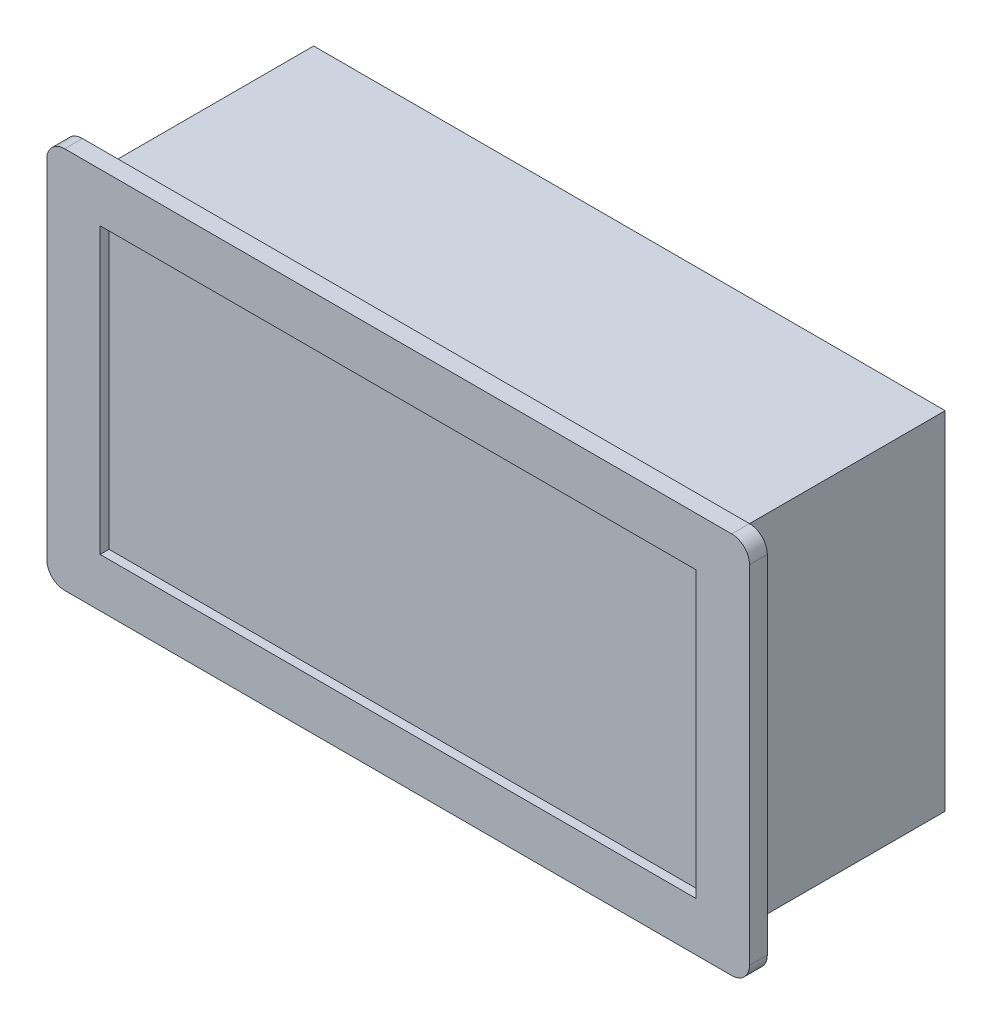
ISO-10303-21;
HEADER;
FILE_DESCRIPTION(('STEP AP214'),'2;1');
FILE_NAME('part.step','',(''),(''),'','','');
FILE_SCHEMA(('AUTOMOTIVE_DESIGN { 1 0 10303 214 1 1 1 1 }'));
ENDSEC;
DATA;
#1=APPLICATION_CONTEXT('core data for automotive mechanical design processes');
#2=APPLICATION_PROTOCOL_DEFINITION('international standard','automotive_design',2000,#1);
#3=PRODUCT_CONTEXT('',#1,'mechanical');
#4=PRODUCT('Part','Part','',(#3));
#5=PRODUCT_RELATED_PRODUCT_CATEGORY('part','',(#4));
#6=PRODUCT_DEFINITION_FORMATION('','',#4);
#7=PRODUCT_DEFINITION_CONTEXT('part definition',#1,'design');
#8=PRODUCT_DEFINITION('design','',#6,#7);
#9=PRODUCT_DEFINITION_SHAPE('','',#8);
#10=(LENGTH_UNIT() NAMED_UNIT(*) SI_UNIT(.MILLI.,.METRE.));
#11=(NAMED_UNIT(*) PLANE_ANGLE_UNIT() SI_UNIT($,.RADIAN.));
#12=(NAMED_UNIT(*) SI_UNIT($,.STERADIAN.) SOLID_ANGLE_UNIT());
#13=UNCERTAINTY_MEASURE_WITH_UNIT(LENGTH_MEASURE(1.E-05),#10,'distance_accuracy_value','');
#14=(GEOMETRIC_REPRESENTATION_CONTEXT(3) GLOBAL_UNCERTAINTY_ASSIGNED_CONTEXT((#13)) GLOBAL_UNIT_ASSIGNED_CONTEXT((#10,
#11,#12)) REPRESENTATION_CONTEXT('',''));
#15=CARTESIAN_POINT('',(0.,0.,0.));
#16=DIRECTION('',(0.,0.,1.));
#17=DIRECTION('',(1.,0.,0.));
#18=AXIS2_PLACEMENT_3D('',#15,#16,#17);
#19=CARTESIAN_POINT('',(-35.5,-19.5,24.));
#20=DIRECTION('',(1.,0.,0.));
#21=DIRECTION('',(0.,0.,-1.));
#22=AXIS2_PLACEMENT_3D('',#19,#20,#21);
#23=PLANE('',#22);
#24=DIRECTION('',(0.,-1.,0.));
#25=VECTOR('',#24,1.);
#26=CARTESIAN_POINT('',(-35.5,-19.5,0.));
#27=LINE('',#26,#25);
#28=CARTESIAN_POINT('',(-35.5,19.5,0.));
#29=VERTEX_POINT('',#28);
#30=CARTESIAN_POINT('',(-35.5,-19.5,0.));
#31=VERTEX_POINT('',#30);
#32=EDGE_CURVE('E253',#29,#31,#27,.T.);
#33=ORIENTED_EDGE('',*,*,#32,.T.);
#34=DIRECTION('',(0.,0.,-1.));
#35=VECTOR('',#34,1.);
#36=CARTESIAN_POINT('',(-35.5,-19.5,24.));
#37=LINE('',#36,#35);
#38=CARTESIAN_POINT('',(-35.5,-19.5,24.));
#39=VERTEX_POINT('',#38);
#40=EDGE_CURVE('E11',#39,#31,#37,.T.);
#41=ORIENTED_EDGE('',*,*,#40,.F.);
#42=DIRECTION('',(0.,-1.,0.));
#43=VECTOR('',#42,1.);
#44=CARTESIAN_POINT('',(-35.5,-19.5,24.));
#45=LINE('',#44,#43);
#46=CARTESIAN_POINT('',(-35.5,19.5,24.));
#47=VERTEX_POINT('',#46);
#48=EDGE_CURVE('E254',#47,#39,#45,.T.);
#49=ORIENTED_EDGE('',*,*,#48,.F.);
#50=DIRECTION('',(0.,0.,-1.));
#51=VECTOR('',#50,1.);
#52=CARTESIAN_POINT('',(-35.5,19.5,24.));
#53=LINE('',#52,#51);
#54=EDGE_CURVE('E264',#47,#29,#53,.T.);
#55=ORIENTED_EDGE('',*,*,#54,.T.);
#56=EDGE_LOOP('',(#33,#41,#49,#55));
#57=FACE_BOUND('',#56,.T.);
#58=ADVANCED_FACE('F35',(#57),#23,.F.);
#59=CARTESIAN_POINT('',(35.5,-19.5,24.));
#60=DIRECTION('',(0.,1.,0.));
#61=DIRECTION('',(-1.,0.,0.));
#62=AXIS2_PLACEMENT_3D('',#59,#60,#61);
#63=PLANE('',#62);
#64=DIRECTION('',(1.,0.,0.));
#65=VECTOR('',#64,1.);
#66=CARTESIAN_POINT('',(35.5,-19.5,0.));
#67=LINE('',#66,#65);
#68=CARTESIAN_POINT('',(35.5,-19.5,0.));
#69=VERTEX_POINT('',#68);
#70=EDGE_CURVE('E267',#31,#69,#67,.T.);
#71=ORIENTED_EDGE('',*,*,#70,.T.);
#72=DIRECTION('',(0.,0.,-1.));
#73=VECTOR('',#72,1.);
#74=CARTESIAN_POINT('',(35.5,-19.5,24.));
#75=LINE('',#74,#73);
#76=CARTESIAN_POINT('',(35.5,-19.5,24.));
#77=VERTEX_POINT('',#76);
#78=EDGE_CURVE('E42',#77,#69,#75,.T.);
#79=ORIENTED_EDGE('',*,*,#78,.F.);
#80=DIRECTION('',(1.,0.,0.));
#81=VECTOR('',#80,1.);
#82=CARTESIAN_POINT('',(35.5,-19.5,24.));
#83=LINE('',#82,#81);
#84=EDGE_CURVE('E83',#39,#77,#83,.T.);
#85=ORIENTED_EDGE('',*,*,#84,.F.);
#86=ORIENTED_EDGE('',*,*,#40,.T.);
#87=EDGE_LOOP('',(#71,#79,#85,#86));
#88=FACE_BOUND('',#87,.T.);
#89=ADVANCED_FACE('F335',(#88),#63,.F.);
#90=CARTESIAN_POINT('',(35.5,-19.5,24.));
#91=DIRECTION('',(-1.,0.,0.));
#92=DIRECTION('',(0.,0.,1.));
#93=AXIS2_PLACEMENT_3D('',#90,#91,#92);
#94=PLANE('',#93);
#95=DIRECTION('',(0.,1.,0.));
#96=VECTOR('',#95,1.);
#97=CARTESIAN_POINT('',(35.5,-19.5,0.));
#98=LINE('',#97,#96);
#99=CARTESIAN_POINT('',(35.5,19.5,0.));
#100=VERTEX_POINT('',#99);
#101=EDGE_CURVE('E269',#69,#100,#98,.T.);
#102=ORIENTED_EDGE('',*,*,#101,.T.);
#103=DIRECTION('',(0.,0.,-1.));
#104=VECTOR('',#103,1.);
#105=CARTESIAN_POINT('',(35.5,19.5,24.));
#106=LINE('',#105,#104);
#107=CARTESIAN_POINT('',(35.5,19.5,24.));
#108=VERTEX_POINT('',#107);
#109=EDGE_CURVE('E58',#108,#100,#106,.T.);
#110=ORIENTED_EDGE('',*,*,#109,.F.);
#111=DIRECTION('',(0.,1.,0.));
#112=VECTOR('',#111,1.);
#113=CARTESIAN_POINT('',(35.5,-19.5,24.));
#114=LINE('',#113,#112);
#115=EDGE_CURVE('E258',#77,#108,#114,.T.);
#116=ORIENTED_EDGE('',*,*,#115,.F.);
#117=ORIENTED_EDGE('',*,*,#78,.T.);
#118=EDGE_LOOP('',(#102,#110,#116,#117));
#119=FACE_BOUND('',#118,.T.);
#120=ADVANCED_FACE('F275',(#119),#94,.F.);
#121=CARTESIAN_POINT('',(35.5,19.5,24.));
#122=DIRECTION('',(0.,-1.,0.));
#123=DIRECTION('',(1.,0.,0.));
#124=AXIS2_PLACEMENT_3D('',#121,#122,#123);
#125=PLANE('',#124);
#126=DIRECTION('',(-1.,0.,0.));
#127=VECTOR('',#126,1.);
#128=CARTESIAN_POINT('',(35.5,19.5,0.));
#129=LINE('',#128,#127);
#130=EDGE_CURVE('E78',#100,#29,#129,.T.);
#131=ORIENTED_EDGE('',*,*,#130,.T.);
#132=ORIENTED_EDGE('',*,*,#54,.F.);
#133=DIRECTION('',(-1.,0.,0.));
#134=VECTOR('',#133,1.);
#135=CARTESIAN_POINT('',(35.5,19.5,24.));
#136=LINE('',#135,#134);
#137=EDGE_CURVE('E261',#108,#47,#136,.T.);
#138=ORIENTED_EDGE('',*,*,#137,.F.);
#139=ORIENTED_EDGE('',*,*,#109,.T.);
#140=EDGE_LOOP('',(#131,#132,#138,#139));
#141=FACE_BOUND('',#140,.T.);
#142=ADVANCED_FACE('F280',(#141),#125,.F.);
#143=CARTESIAN_POINT('',(0.,0.,0.));
#144=DIRECTION('',(0.,0.,1.));
#145=DIRECTION('',(1.,0.,0.));
#146=AXIS2_PLACEMENT_3D('',#143,#144,#145);
#147=PLANE('',#146);
#148=ORIENTED_EDGE('',*,*,#32,.F.);
#149=ORIENTED_EDGE('',*,*,#130,.F.);
#150=ORIENTED_EDGE('',*,*,#101,.F.);
#151=ORIENTED_EDGE('',*,*,#70,.F.);
#152=EDGE_LOOP('',(#148,#149,#150,#151));
#153=FACE_BOUND('',#152,.T.);
#154=ADVANCED_FACE('F278',(#153),#147,.F.);
#155=CARTESIAN_POINT('',(-37.5,-19.5,26.));
#156=DIRECTION('',(0.,0.,-1.));
#157=DIRECTION('',(-1.,0.,0.));
#158=AXIS2_PLACEMENT_3D('',#155,#156,#157);
#159=CYLINDRICAL_SURFACE('',#158,2.);
#160=CARTESIAN_POINT('',(-37.5,-19.5,24.));
#161=DIRECTION('',(0.,0.,1.));
#162=DIRECTION('',(-1.,0.,0.));
#163=AXIS2_PLACEMENT_3D('',#160,#161,#162);
#164=CIRCLE('',#163,2.);
#165=CARTESIAN_POINT('',(-39.5,-19.5,24.));
#166=VERTEX_POINT('',#165);
#167=CARTESIAN_POINT('',(-37.5,-21.5,24.));
#168=VERTEX_POINT('',#167);
#169=EDGE_CURVE('E192',#166,#168,#164,.T.);
#170=ORIENTED_EDGE('',*,*,#169,.T.);
#171=DIRECTION('',(0.,0.,-1.));
#172=VECTOR('',#171,1.);
#173=CARTESIAN_POINT('',(-37.5,-21.5,26.));
#174=LINE('',#173,#172);
#175=CARTESIAN_POINT('',(-37.5,-21.5,26.));
#176=VERTEX_POINT('',#175);
#177=EDGE_CURVE('E250',#176,#168,#174,.T.);
#178=ORIENTED_EDGE('',*,*,#177,.F.);
#179=CARTESIAN_POINT('',(-37.5,-19.5,26.));
#180=DIRECTION('',(0.,0.,1.));
#181=DIRECTION('',(-1.,0.,0.));
#182=AXIS2_PLACEMENT_3D('',#179,#180,#181);
#183=CIRCLE('',#182,2.);
#184=CARTESIAN_POINT('',(-39.5,-19.5,26.));
#185=VERTEX_POINT('',#184);
#186=EDGE_CURVE('E196',#185,#176,#183,.T.);
#187=ORIENTED_EDGE('',*,*,#186,.F.);
#188=DIRECTION('',(0.,0.,-1.));
#189=VECTOR('',#188,1.);
#190=CARTESIAN_POINT('',(-39.5,-19.5,26.));
#191=LINE('',#190,#189);
#192=EDGE_CURVE('E214',#185,#166,#191,.T.);
#193=ORIENTED_EDGE('',*,*,#192,.T.);
#194=EDGE_LOOP('',(#170,#178,#187,#193));
#195=FACE_BOUND('',#194,.T.);
#196=ADVANCED_FACE('F293',(#195),#159,.T.);
#197=CARTESIAN_POINT('',(-37.5,-21.5,26.));
#198=DIRECTION('',(0.,1.,0.));
#199=DIRECTION('',(0.,0.,1.));
#200=AXIS2_PLACEMENT_3D('',#197,#198,#199);
#201=PLANE('',#200);
#202=DIRECTION('',(1.,0.,0.));
#203=VECTOR('',#202,1.);
#204=CARTESIAN_POINT('',(-37.5,-21.5,24.));
#205=LINE('',#204,#203);
#206=CARTESIAN_POINT('',(37.5,-21.5,24.));
#207=VERTEX_POINT('',#206);
#208=EDGE_CURVE('E217',#168,#207,#205,.T.);
#209=ORIENTED_EDGE('',*,*,#208,.T.);
#210=DIRECTION('',(0.,0.,-1.));
#211=VECTOR('',#210,1.);
#212=CARTESIAN_POINT('',(37.5,-21.5,26.));
#213=LINE('',#212,#211);
#214=CARTESIAN_POINT('',(37.5,-21.5,26.));
#215=VERTEX_POINT('',#214);
#216=EDGE_CURVE('E247',#215,#207,#213,.T.);
#217=ORIENTED_EDGE('',*,*,#216,.F.);
#218=DIRECTION('',(1.,0.,0.));
#219=VECTOR('',#218,1.);
#220=CARTESIAN_POINT('',(-37.5,-21.5,26.));
#221=LINE('',#220,#219);
#222=EDGE_CURVE('E199',#176,#215,#221,.T.);
#223=ORIENTED_EDGE('',*,*,#222,.F.);
#224=ORIENTED_EDGE('',*,*,#177,.T.);
#225=EDGE_LOOP('',(#209,#217,#223,#224));
#226=FACE_BOUND('',#225,.T.);
#227=ADVANCED_FACE('F324',(#226),#201,.F.);
#228=CARTESIAN_POINT('',(37.5,-19.5,26.));
#229=DIRECTION('',(0.,0.,-1.));
#230=DIRECTION('',(-1.,0.,0.));
#231=AXIS2_PLACEMENT_3D('',#228,#229,#230);
#232=CYLINDRICAL_SURFACE('',#231,2.);
#233=CARTESIAN_POINT('',(37.5,-19.5,24.));
#234=DIRECTION('',(0.,0.,1.));
#235=DIRECTION('',(1.,0.,0.));
#236=AXIS2_PLACEMENT_3D('',#233,#234,#235);
#237=CIRCLE('',#236,2.);
#238=CARTESIAN_POINT('',(39.5,-19.5,24.));
#239=VERTEX_POINT('',#238);
#240=EDGE_CURVE('E219',#207,#239,#237,.T.);
#241=ORIENTED_EDGE('',*,*,#240,.T.);
#242=DIRECTION('',(0.,0.,-1.));
#243=VECTOR('',#242,1.);
#244=CARTESIAN_POINT('',(39.5,-19.5,26.));
#245=LINE('',#244,#243);
#246=CARTESIAN_POINT('',(39.5,-19.5,26.));
#247=VERTEX_POINT('',#246);
#248=EDGE_CURVE('E244',#247,#239,#245,.T.);
#249=ORIENTED_EDGE('',*,*,#248,.F.);
#250=CARTESIAN_POINT('',(37.5,-19.5,26.));
#251=DIRECTION('',(0.,0.,1.));
#252=DIRECTION('',(1.,0.,0.));
#253=AXIS2_PLACEMENT_3D('',#250,#251,#252);
#254=CIRCLE('',#253,2.);
#255=EDGE_CURVE('E202',#215,#247,#254,.T.);
#256=ORIENTED_EDGE('',*,*,#255,.F.);
#257=ORIENTED_EDGE('',*,*,#216,.T.);
#258=EDGE_LOOP('',(#241,#249,#256,#257));
#259=FACE_BOUND('',#258,.T.);
#260=ADVANCED_FACE('F320',(#259),#232,.T.);
#261=CARTESIAN_POINT('',(39.5,-19.5,26.));
#262=DIRECTION('',(-1.,0.,0.));
#263=DIRECTION('',(0.,0.,1.));
#264=AXIS2_PLACEMENT_3D('',#261,#262,#263);
#265=PLANE('',#264);
#266=DIRECTION('',(0.,1.,0.));
#267=VECTOR('',#266,1.);
#268=CARTESIAN_POINT('',(39.5,-19.5,24.));
#269=LINE('',#268,#267);
#270=CARTESIAN_POINT('',(39.5,19.5,24.));
#271=VERTEX_POINT('',#270);
#272=EDGE_CURVE('E221',#239,#271,#269,.T.);
#273=ORIENTED_EDGE('',*,*,#272,.T.);
#274=DIRECTION('',(0.,0.,-1.));
#275=VECTOR('',#274,1.);
#276=CARTESIAN_POINT('',(39.5,19.5,26.));
#277=LINE('',#276,#275);
#278=CARTESIAN_POINT('',(39.5,19.5,26.));
#279=VERTEX_POINT('',#278);
#280=EDGE_CURVE('E241',#279,#271,#277,.T.);
#281=ORIENTED_EDGE('',*,*,#280,.F.);
#282=DIRECTION('',(0.,1.,0.));
#283=VECTOR('',#282,1.);
#284=CARTESIAN_POINT('',(39.5,-19.5,26.));
#285=LINE('',#284,#283);
#286=EDGE_CURVE('E204',#247,#279,#285,.T.);
#287=ORIENTED_EDGE('',*,*,#286,.F.);
#288=ORIENTED_EDGE('',*,*,#248,.T.);
#289=EDGE_LOOP('',(#273,#281,#287,#288));
#290=FACE_BOUND('',#289,.T.);
#291=ADVANCED_FACE('F317',(#290),#265,.F.);
#292=CARTESIAN_POINT('',(37.5,19.5,26.));
#293=DIRECTION('',(0.,0.,-1.));
#294=DIRECTION('',(-1.,0.,0.));
#295=AXIS2_PLACEMENT_3D('',#292,#293,#294);
#296=CYLINDRICAL_SURFACE('',#295,2.);
#297=CARTESIAN_POINT('',(37.5,19.5,24.));
#298=DIRECTION('',(0.,0.,1.));
#299=DIRECTION('',(-1.,0.,0.));
#300=AXIS2_PLACEMENT_3D('',#297,#298,#299);
#301=CIRCLE('',#300,2.);
#302=CARTESIAN_POINT('',(37.5,21.5,24.));
#303=VERTEX_POINT('',#302);
#304=EDGE_CURVE('E223',#271,#303,#301,.T.);
#305=ORIENTED_EDGE('',*,*,#304,.T.);
#306=DIRECTION('',(0.,0.,-1.));
#307=VECTOR('',#306,1.);
#308=CARTESIAN_POINT('',(37.5,21.5,26.));
#309=LINE('',#308,#307);
#310=CARTESIAN_POINT('',(37.5,21.5,26.));
#311=VERTEX_POINT('',#310);
#312=EDGE_CURVE('E238',#311,#303,#309,.T.);
#313=ORIENTED_EDGE('',*,*,#312,.F.);
#314=CARTESIAN_POINT('',(37.5,19.5,26.));
#315=DIRECTION('',(0.,0.,1.));
#316=DIRECTION('',(-1.,0.,0.));
#317=AXIS2_PLACEMENT_3D('',#314,#315,#316);
#318=CIRCLE('',#317,2.);
#319=EDGE_CURVE('E206',#279,#311,#318,.T.);
#320=ORIENTED_EDGE('',*,*,#319,.F.);
#321=ORIENTED_EDGE('',*,*,#280,.T.);
#322=EDGE_LOOP('',(#305,#313,#320,#321));
#323=FACE_BOUND('',#322,.T.);
#324=ADVANCED_FACE('F313',(#323),#296,.T.);
#325=CARTESIAN_POINT('',(-37.5,21.5,26.));
#326=DIRECTION('',(0.,-1.,0.));
#327=DIRECTION('',(0.,0.,-1.));
#328=AXIS2_PLACEMENT_3D('',#325,#326,#327);
#329=PLANE('',#328);
#330=DIRECTION('',(-1.,0.,0.));
#331=VECTOR('',#330,1.);
#332=CARTESIAN_POINT('',(-37.5,21.5,24.));
#333=LINE('',#332,#331);
#334=CARTESIAN_POINT('',(-37.5,21.5,24.));
#335=VERTEX_POINT('',#334);
#336=EDGE_CURVE('E225',#303,#335,#333,.T.);
#337=ORIENTED_EDGE('',*,*,#336,.T.);
#338=DIRECTION('',(0.,0.,-1.));
#339=VECTOR('',#338,1.);
#340=CARTESIAN_POINT('',(-37.5,21.5,26.));
#341=LINE('',#340,#339);
#342=CARTESIAN_POINT('',(-37.5,21.5,26.));
#343=VERTEX_POINT('',#342);
#344=EDGE_CURVE('E235',#343,#335,#341,.T.);
#345=ORIENTED_EDGE('',*,*,#344,.F.);
#346=DIRECTION('',(-1.,0.,0.));
#347=VECTOR('',#346,1.);
#348=CARTESIAN_POINT('',(-37.5,21.5,26.));
#349=LINE('',#348,#347);
#350=EDGE_CURVE('E208',#311,#343,#349,.T.);
#351=ORIENTED_EDGE('',*,*,#350,.F.);
#352=ORIENTED_EDGE('',*,*,#312,.T.);
#353=EDGE_LOOP('',(#337,#345,#351,#352));
#354=FACE_BOUND('',#353,.T.);
#355=ADVANCED_FACE('F308',(#354),#329,.F.);
#356=CARTESIAN_POINT('',(-37.5,19.5,26.));
#357=DIRECTION('',(0.,0.,-1.));
#358=DIRECTION('',(-1.,0.,0.));
#359=AXIS2_PLACEMENT_3D('',#356,#357,#358);
#360=CYLINDRICAL_SURFACE('',#359,2.);
#361=CARTESIAN_POINT('',(-37.5,19.5,24.));
#362=DIRECTION('',(0.,0.,1.));
#363=DIRECTION('',(-1.,0.,0.));
#364=AXIS2_PLACEMENT_3D('',#361,#362,#363);
#365=CIRCLE('',#364,2.);
#366=CARTESIAN_POINT('',(-39.5,19.5,24.));
#367=VERTEX_POINT('',#366);
#368=EDGE_CURVE('E227',#335,#367,#365,.T.);
#369=ORIENTED_EDGE('',*,*,#368,.T.);
#370=DIRECTION('',(0.,0.,-1.));
#371=VECTOR('',#370,1.);
#372=CARTESIAN_POINT('',(-39.5,19.5,26.));
#373=LINE('',#372,#371);
#374=CARTESIAN_POINT('',(-39.5,19.5,26.));
#375=VERTEX_POINT('',#374);
#376=EDGE_CURVE('E232',#375,#367,#373,.T.);
#377=ORIENTED_EDGE('',*,*,#376,.F.);
#378=CARTESIAN_POINT('',(-37.5,19.5,26.));
#379=DIRECTION('',(0.,0.,1.));
#380=DIRECTION('',(-1.,0.,0.));
#381=AXIS2_PLACEMENT_3D('',#378,#379,#380);
#382=CIRCLE('',#381,2.);
#383=EDGE_CURVE('E210',#343,#375,#382,.T.);
#384=ORIENTED_EDGE('',*,*,#383,.F.);
#385=ORIENTED_EDGE('',*,*,#344,.T.);
#386=EDGE_LOOP('',(#369,#377,#384,#385));
#387=FACE_BOUND('',#386,.T.);
#388=ADVANCED_FACE('F302',(#387),#360,.T.);
#389=CARTESIAN_POINT('',(-39.5,-19.5,26.));
#390=DIRECTION('',(1.,0.,0.));
#391=DIRECTION('',(0.,0.,-1.));
#392=AXIS2_PLACEMENT_3D('',#389,#390,#391);
#393=PLANE('',#392);
#394=DIRECTION('',(0.,-1.,0.));
#395=VECTOR('',#394,1.);
#396=CARTESIAN_POINT('',(-39.5,-19.5,24.));
#397=LINE('',#396,#395);
#398=EDGE_CURVE('E200',#367,#166,#397,.T.);
#399=ORIENTED_EDGE('',*,*,#398,.T.);
#400=ORIENTED_EDGE('',*,*,#192,.F.);
#401=DIRECTION('',(0.,-1.,0.));
#402=VECTOR('',#401,1.);
#403=CARTESIAN_POINT('',(-39.5,-19.5,26.));
#404=LINE('',#403,#402);
#405=EDGE_CURVE('E212',#375,#185,#404,.T.);
#406=ORIENTED_EDGE('',*,*,#405,.F.);
#407=ORIENTED_EDGE('',*,*,#376,.T.);
#408=EDGE_LOOP('',(#399,#400,#406,#407));
#409=FACE_BOUND('',#408,.T.);
#410=ADVANCED_FACE('F298',(#409),#393,.F.);
#411=CARTESIAN_POINT('',(-37.5,-19.5,26.));
#412=DIRECTION('',(0.,0.,-1.));
#413=DIRECTION('',(-1.,0.,0.));
#414=AXIS2_PLACEMENT_3D('',#411,#412,#413);
#415=PLANE('',#414);
#416=DIRECTION('',(-1.,0.,0.));
#417=VECTOR('',#416,1.);
#418=CARTESIAN_POINT('',(-33.5,16.,26.));
#419=LINE('',#418,#417);
#420=CARTESIAN_POINT('',(33.5,16.,26.));
#421=VERTEX_POINT('',#420);
#422=CARTESIAN_POINT('',(-33.5,16.,26.));
#423=VERTEX_POINT('',#422);
#424=EDGE_CURVE('E186',#421,#423,#419,.T.);
#425=ORIENTED_EDGE('',*,*,#424,.F.);
#426=DIRECTION('',(0.,1.,0.));
#427=VECTOR('',#426,1.);
#428=CARTESIAN_POINT('',(33.5,-16.,26.));
#429=LINE('',#428,#427);
#430=CARTESIAN_POINT('',(33.5,-16.,26.));
#431=VERTEX_POINT('',#430);
#432=EDGE_CURVE('E49',#431,#421,#429,.T.);
#433=ORIENTED_EDGE('',*,*,#432,.F.);
#434=DIRECTION('',(1.,0.,0.));
#435=VECTOR('',#434,1.);
#436=CARTESIAN_POINT('',(-33.5,-16.,26.));
#437=LINE('',#436,#435);
#438=CARTESIAN_POINT('',(-33.5,-16.,26.));
#439=VERTEX_POINT('',#438);
#440=EDGE_CURVE('E177',#439,#431,#437,.T.);
#441=ORIENTED_EDGE('',*,*,#440,.F.);
#442=DIRECTION('',(0.,-1.,0.));
#443=VECTOR('',#442,1.);
#444=CARTESIAN_POINT('',(-33.5,-16.,26.));
#445=LINE('',#444,#443);
#446=EDGE_CURVE('E180',#423,#439,#445,.T.);
#447=ORIENTED_EDGE('',*,*,#446,.F.);
#448=EDGE_LOOP('',(#425,#433,#441,#447));
#449=FACE_BOUND('',#448,.T.);
#450=ORIENTED_EDGE('',*,*,#186,.T.);
#451=ORIENTED_EDGE('',*,*,#222,.T.);
#452=ORIENTED_EDGE('',*,*,#255,.T.);
#453=ORIENTED_EDGE('',*,*,#286,.T.);
#454=ORIENTED_EDGE('',*,*,#319,.T.);
#455=ORIENTED_EDGE('',*,*,#350,.T.);
#456=ORIENTED_EDGE('',*,*,#383,.T.);
#457=ORIENTED_EDGE('',*,*,#405,.T.);
#458=EDGE_LOOP('',(#450,#451,#452,#453,#454,#455,#456,#457));
#459=FACE_BOUND('',#458,.T.);
#460=ADVANCED_FACE('F285',(#449,#459),#415,.F.);
#461=CARTESIAN_POINT('',(-37.5,-19.5,24.));
#462=DIRECTION('',(0.,0.,-1.));
#463=DIRECTION('',(-1.,0.,0.));
#464=AXIS2_PLACEMENT_3D('',#461,#462,#463);
#465=PLANE('',#464);
#466=ORIENTED_EDGE('',*,*,#137,.T.);
#467=ORIENTED_EDGE('',*,*,#48,.T.);
#468=ORIENTED_EDGE('',*,*,#84,.T.);
#469=ORIENTED_EDGE('',*,*,#115,.T.);
#470=EDGE_LOOP('',(#466,#467,#468,#469));
#471=FACE_BOUND('',#470,.T.);
#472=ORIENTED_EDGE('',*,*,#169,.F.);
#473=ORIENTED_EDGE('',*,*,#398,.F.);
#474=ORIENTED_EDGE('',*,*,#368,.F.);
#475=ORIENTED_EDGE('',*,*,#336,.F.);
#476=ORIENTED_EDGE('',*,*,#304,.F.);
#477=ORIENTED_EDGE('',*,*,#272,.F.);
#478=ORIENTED_EDGE('',*,*,#240,.F.);
#479=ORIENTED_EDGE('',*,*,#208,.F.);
#480=EDGE_LOOP('',(#472,#473,#474,#475,#476,#477,#478,#479));
#481=FACE_BOUND('',#480,.T.);
#482=ADVANCED_FACE('F282',(#471,#481),#465,.T.);
#483=CARTESIAN_POINT('',(33.5,-16.,25.));
#484=DIRECTION('',(1.,0.,0.));
#485=DIRECTION('',(0.,0.,-1.));
#486=AXIS2_PLACEMENT_3D('',#483,#484,#485);
#487=PLANE('',#486);
#488=ORIENTED_EDGE('',*,*,#432,.T.);
#489=DIRECTION('',(0.,0.,1.));
#490=VECTOR('',#489,1.);
#491=CARTESIAN_POINT('',(33.5,16.,25.));
#492=LINE('',#491,#490);
#493=CARTESIAN_POINT('',(33.5,16.,25.));
#494=VERTEX_POINT('',#493);
#495=EDGE_CURVE('E155',#494,#421,#492,.T.);
#496=ORIENTED_EDGE('',*,*,#495,.F.);
#497=DIRECTION('',(0.,1.,0.));
#498=VECTOR('',#497,1.);
#499=CARTESIAN_POINT('',(33.5,-16.,25.));
#500=LINE('',#499,#498);
#501=CARTESIAN_POINT('',(33.5,-16.,25.));
#502=VERTEX_POINT('',#501);
#503=EDGE_CURVE('E159',#502,#494,#500,.T.);
#504=ORIENTED_EDGE('',*,*,#503,.F.);
#505=DIRECTION('',(0.,0.,1.));
#506=VECTOR('',#505,1.);
#507=CARTESIAN_POINT('',(33.5,-16.,25.));
#508=LINE('',#507,#506);
#509=EDGE_CURVE('E190',#502,#431,#508,.T.);
#510=ORIENTED_EDGE('',*,*,#509,.T.);
#511=EDGE_LOOP('',(#488,#496,#504,#510));
#512=FACE_BOUND('',#511,.T.);
#513=ADVANCED_FACE('F157',(#512),#487,.F.);
#514=CARTESIAN_POINT('',(-33.5,-16.,25.));
#515=DIRECTION('',(0.,-1.,0.));
#516=DIRECTION('',(0.,0.,-1.));
#517=AXIS2_PLACEMENT_3D('',#514,#515,#516);
#518=PLANE('',#517);
#519=ORIENTED_EDGE('',*,*,#440,.T.);
#520=ORIENTED_EDGE('',*,*,#509,.F.);
#521=DIRECTION('',(1.,0.,0.));
#522=VECTOR('',#521,1.);
#523=CARTESIAN_POINT('',(-33.5,-16.,25.));
#524=LINE('',#523,#522);
#525=CARTESIAN_POINT('',(-33.5,-16.,25.));
#526=VERTEX_POINT('',#525);
#527=EDGE_CURVE('E165',#526,#502,#524,.T.);
#528=ORIENTED_EDGE('',*,*,#527,.F.);
#529=DIRECTION('',(0.,0.,1.));
#530=VECTOR('',#529,1.);
#531=CARTESIAN_POINT('',(-33.5,-16.,25.));
#532=LINE('',#531,#530);
#533=EDGE_CURVE('E193',#526,#439,#532,.T.);
#534=ORIENTED_EDGE('',*,*,#533,.T.);
#535=EDGE_LOOP('',(#519,#520,#528,#534));
#536=FACE_BOUND('',#535,.T.);
#537=ADVANCED_FACE('F388',(#536),#518,.F.);
#538=CARTESIAN_POINT('',(-33.5,-16.,25.));
#539=DIRECTION('',(-1.,0.,0.));
#540=DIRECTION('',(0.,0.,1.));
#541=AXIS2_PLACEMENT_3D('',#538,#539,#540);
#542=PLANE('',#541);
#543=ORIENTED_EDGE('',*,*,#446,.T.);
#544=ORIENTED_EDGE('',*,*,#533,.F.);
#545=DIRECTION('',(0.,-1.,0.));
#546=VECTOR('',#545,1.);
#547=CARTESIAN_POINT('',(-33.5,-16.,25.));
#548=LINE('',#547,#546);
#549=CARTESIAN_POINT('',(-33.5,16.,25.));
#550=VERTEX_POINT('',#549);
#551=EDGE_CURVE('E173',#550,#526,#548,.T.);
#552=ORIENTED_EDGE('',*,*,#551,.F.);
#553=DIRECTION('',(0.,0.,1.));
#554=VECTOR('',#553,1.);
#555=CARTESIAN_POINT('',(-33.5,16.,25.));
#556=LINE('',#555,#554);
#557=EDGE_CURVE('E164',#550,#423,#556,.T.);
#558=ORIENTED_EDGE('',*,*,#557,.T.);
#559=EDGE_LOOP('',(#543,#544,#552,#558));
#560=FACE_BOUND('',#559,.T.);
#561=ADVANCED_FACE('F396',(#560),#542,.F.);
#562=CARTESIAN_POINT('',(-33.5,16.,25.));
#563=DIRECTION('',(0.,1.,0.));
#564=DIRECTION('',(0.,0.,1.));
#565=AXIS2_PLACEMENT_3D('',#562,#563,#564);
#566=PLANE('',#565);
#567=ORIENTED_EDGE('',*,*,#424,.T.);
#568=ORIENTED_EDGE('',*,*,#557,.F.);
#569=DIRECTION('',(-1.,0.,0.));
#570=VECTOR('',#569,1.);
#571=CARTESIAN_POINT('',(-33.5,16.,25.));
#572=LINE('',#571,#570);
#573=EDGE_CURVE('E168',#494,#550,#572,.T.);
#574=ORIENTED_EDGE('',*,*,#573,.F.);
#575=ORIENTED_EDGE('',*,*,#495,.T.);
#576=EDGE_LOOP('',(#567,#568,#574,#575));
#577=FACE_BOUND('',#576,.T.);
#578=ADVANCED_FACE('F169',(#577),#566,.F.);
#579=CARTESIAN_POINT('',(0.,0.,25.));
#580=DIRECTION('',(0.,0.,-1.));
#581=DIRECTION('',(-1.,0.,0.));
#582=AXIS2_PLACEMENT_3D('',#579,#580,#581);
#583=PLANE('',#582);
#584=ORIENTED_EDGE('',*,*,#503,.T.);
#585=ORIENTED_EDGE('',*,*,#573,.T.);
#586=ORIENTED_EDGE('',*,*,#551,.T.);
#587=ORIENTED_EDGE('',*,*,#527,.T.);
#588=EDGE_LOOP('',(#584,#585,#586,#587));
#589=FACE_BOUND('',#588,.T.);
#590=ADVANCED_FACE('F175',(#589),#583,.F.);
#591=CLOSED_SHELL('',(#58,#89,#120,#142,#154,#196,#227,#260,#291,#324,#355,#388,#410,#460,#482,
#513,#537,#561,#578,#590));
#592=MANIFOLD_SOLID_BREP('B2',#591);
#593=ADVANCED_BREP_SHAPE_REPRESENTATION('',(#18,#592),#14);
#594=SHAPE_DEFINITION_REPRESENTATION(#9,#593);
ENDSEC;
END-ISO-10303-21;
